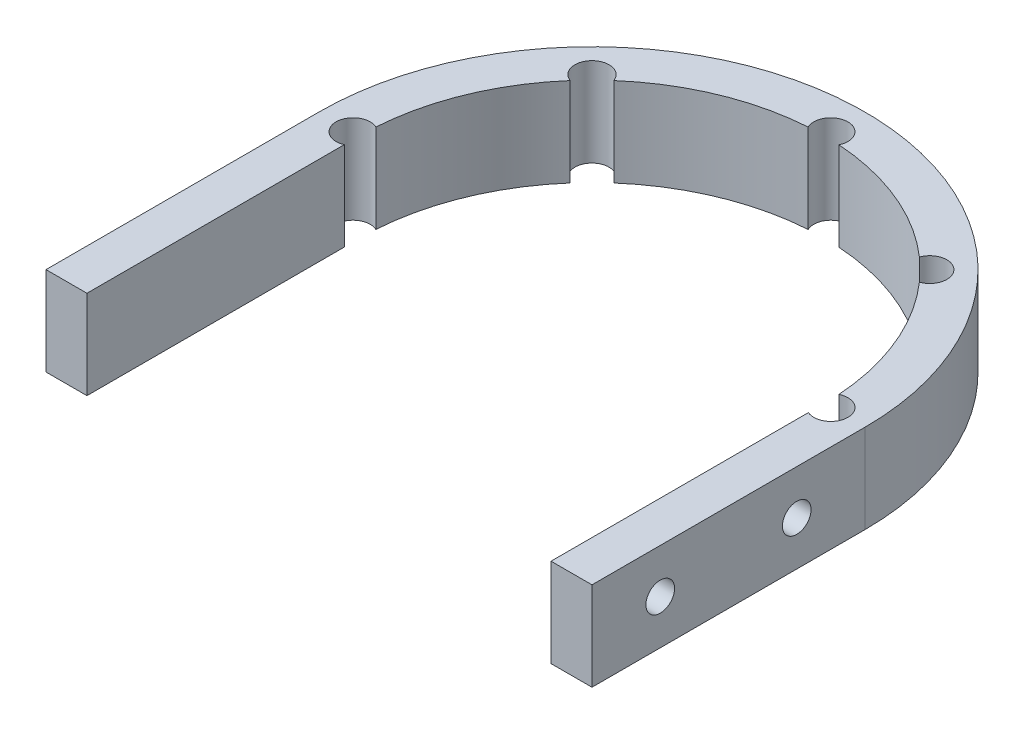
ISO-10303-21;
HEADER;
FILE_DESCRIPTION(('STEP AP214'),'2;1');
FILE_NAME('part.step','',(''),(''),'','','');
FILE_SCHEMA(('AUTOMOTIVE_DESIGN { 1 0 10303 214 1 1 1 1 }'));
ENDSEC;
DATA;
#1=APPLICATION_CONTEXT('core data for automotive mechanical design processes');
#2=APPLICATION_PROTOCOL_DEFINITION('international standard','automotive_design',2000,#1);
#3=PRODUCT_CONTEXT('',#1,'mechanical');
#4=PRODUCT('Part','Part','',(#3));
#5=PRODUCT_RELATED_PRODUCT_CATEGORY('part','',(#4));
#6=PRODUCT_DEFINITION_FORMATION('','',#4);
#7=PRODUCT_DEFINITION_CONTEXT('part definition',#1,'design');
#8=PRODUCT_DEFINITION('design','',#6,#7);
#9=PRODUCT_DEFINITION_SHAPE('','',#8);
#10=(LENGTH_UNIT() NAMED_UNIT(*) SI_UNIT(.MILLI.,.METRE.));
#11=(NAMED_UNIT(*) PLANE_ANGLE_UNIT() SI_UNIT($,.RADIAN.));
#12=(NAMED_UNIT(*) SI_UNIT($,.STERADIAN.) SOLID_ANGLE_UNIT());
#13=UNCERTAINTY_MEASURE_WITH_UNIT(LENGTH_MEASURE(1.E-05),#10,'distance_accuracy_value','');
#14=(GEOMETRIC_REPRESENTATION_CONTEXT(3) GLOBAL_UNCERTAINTY_ASSIGNED_CONTEXT((#13)) GLOBAL_UNIT_ASSIGNED_CONTEXT((#10,
#11,#12)) REPRESENTATION_CONTEXT('',''));
#15=CARTESIAN_POINT('',(0.,0.,0.));
#16=DIRECTION('',(0.,0.,1.));
#17=DIRECTION('',(1.,0.,0.));
#18=AXIS2_PLACEMENT_3D('',#15,#16,#17);
#19=CARTESIAN_POINT('',(-40.,13.,40.));
#20=DIRECTION('',(0.,0.,-1.));
#21=DIRECTION('',(-1.,0.,0.));
#22=AXIS2_PLACEMENT_3D('',#19,#20,#21);
#23=PLANE('',#22);
#24=DIRECTION('',(1.,0.,0.));
#25=VECTOR('',#24,1.);
#26=CARTESIAN_POINT('',(-40.,0.,40.));
#27=LINE('',#26,#25);
#28=CARTESIAN_POINT('',(-40.,0.,40.));
#29=VERTEX_POINT('',#28);
#30=CARTESIAN_POINT('',(-34.,0.,40.));
#31=VERTEX_POINT('',#30);
#32=EDGE_CURVE('E169',#29,#31,#27,.T.);
#33=ORIENTED_EDGE('',*,*,#32,.T.);
#34=DIRECTION('',(0.,1.,0.));
#35=VECTOR('',#34,1.);
#36=CARTESIAN_POINT('',(-34.,0.,40.));
#37=LINE('',#36,#35);
#38=CARTESIAN_POINT('',(-34.,13.,40.));
#39=VERTEX_POINT('',#38);
#40=EDGE_CURVE('E153',#31,#39,#37,.T.);
#41=ORIENTED_EDGE('',*,*,#40,.T.);
#42=DIRECTION('',(1.,0.,0.));
#43=VECTOR('',#42,1.);
#44=CARTESIAN_POINT('',(-40.,13.,40.));
#45=LINE('',#44,#43);
#46=CARTESIAN_POINT('',(-40.,13.,40.));
#47=VERTEX_POINT('',#46);
#48=EDGE_CURVE('E286',#47,#39,#45,.T.);
#49=ORIENTED_EDGE('',*,*,#48,.F.);
#50=DIRECTION('',(0.,-1.,0.));
#51=VECTOR('',#50,1.);
#52=CARTESIAN_POINT('',(-40.,13.,40.));
#53=LINE('',#52,#51);
#54=EDGE_CURVE('E176',#47,#29,#53,.T.);
#55=ORIENTED_EDGE('',*,*,#54,.T.);
#56=EDGE_LOOP('',(#33,#41,#49,#55));
#57=FACE_BOUND('',#56,.T.);
#58=ADVANCED_FACE('F42',(#57),#23,.F.);
#59=CARTESIAN_POINT('',(0.,13.,0.));
#60=DIRECTION('',(0.,-1.,0.));
#61=DIRECTION('',(0.,0.,-1.));
#62=AXIS2_PLACEMENT_3D('',#59,#60,#61);
#63=CYLINDRICAL_SURFACE('',#62,34.);
#64=DIRECTION('',(0.,1.,0.));
#65=VECTOR('',#64,1.);
#66=CARTESIAN_POINT('',(2.25707221860532,6.5,-33.925));
#67=LINE('',#66,#65);
#68=CARTESIAN_POINT('',(2.25707221860533,0.,-33.925));
#69=VERTEX_POINT('',#68);
#70=CARTESIAN_POINT('',(2.25707221860533,13.,-33.925));
#71=VERTEX_POINT('',#70);
#72=EDGE_CURVE('E226',#69,#71,#67,.T.);
#73=ORIENTED_EDGE('',*,*,#72,.F.);
#74=CARTESIAN_POINT('',(0.,0.,0.));
#75=DIRECTION('',(0.,1.,0.));
#76=DIRECTION('',(0.,0.,1.));
#77=AXIS2_PLACEMENT_3D('',#74,#75,#76);
#78=CIRCLE('',#77,34.);
#79=CARTESIAN_POINT('',(22.39260648035,0.,-25.5845886231572));
#80=VERTEX_POINT('',#79);
#81=EDGE_CURVE('E331',#80,#69,#78,.T.);
#82=ORIENTED_EDGE('',*,*,#81,.F.);
#83=DIRECTION('',(0.,1.,0.));
#84=VECTOR('',#83,1.);
#85=CARTESIAN_POINT('',(22.39260648035,6.5,-25.5845886231572));
#86=LINE('',#85,#84);
#87=CARTESIAN_POINT('',(22.39260648035,13.,-25.5845886231572));
#88=VERTEX_POINT('',#87);
#89=EDGE_CURVE('E217',#88,#80,#86,.F.);
#90=ORIENTED_EDGE('',*,*,#89,.F.);
#91=CARTESIAN_POINT('',(0.,13.,0.));
#92=DIRECTION('',(0.,1.,0.));
#93=DIRECTION('',(0.,0.,1.));
#94=AXIS2_PLACEMENT_3D('',#91,#92,#93);
#95=CIRCLE('',#94,34.);
#96=EDGE_CURVE('E298',#88,#71,#95,.T.);
#97=ORIENTED_EDGE('',*,*,#96,.T.);
#98=EDGE_LOOP('',(#73,#82,#90,#97));
#99=FACE_BOUND('',#98,.T.);
#100=ADVANCED_FACE('F399',(#99),#63,.F.);
#101=DIRECTION('',(0.,1.,0.));
#102=VECTOR('',#101,1.);
#103=CARTESIAN_POINT('',(25.5845886231572,6.5,-22.39260648035));
#104=LINE('',#103,#102);
#105=CARTESIAN_POINT('',(25.5845886231572,0.,-22.39260648035));
#106=VERTEX_POINT('',#105);
#107=CARTESIAN_POINT('',(25.5845886231572,13.,-22.39260648035));
#108=VERTEX_POINT('',#107);
#109=EDGE_CURVE('E220',#106,#108,#104,.T.);
#110=ORIENTED_EDGE('',*,*,#109,.F.);
#111=CARTESIAN_POINT('',(33.925,0.,-2.25707221860534));
#112=VERTEX_POINT('',#111);
#113=EDGE_CURVE('E273',#112,#106,#78,.T.);
#114=ORIENTED_EDGE('',*,*,#113,.F.);
#115=DIRECTION('',(0.,1.,0.));
#116=VECTOR('',#115,1.);
#117=CARTESIAN_POINT('',(33.925,6.5,-2.25707221860533));
#118=LINE('',#117,#116);
#119=CARTESIAN_POINT('',(33.925,13.,-2.25707221860534));
#120=VERTEX_POINT('',#119);
#121=EDGE_CURVE('E213',#120,#112,#118,.F.);
#122=ORIENTED_EDGE('',*,*,#121,.F.);
#123=EDGE_CURVE('E243',#120,#108,#95,.T.);
#124=ORIENTED_EDGE('',*,*,#123,.T.);
#125=EDGE_LOOP('',(#110,#114,#122,#124));
#126=FACE_BOUND('',#125,.T.);
#127=ADVANCED_FACE('F337',(#126),#63,.F.);
#128=DIRECTION('',(0.,1.,0.));
#129=VECTOR('',#128,1.);
#130=CARTESIAN_POINT('',(-33.925,6.5,-2.25707221860532));
#131=LINE('',#130,#129);
#132=CARTESIAN_POINT('',(-33.925,0.,-2.25707221860533));
#133=VERTEX_POINT('',#132);
#134=CARTESIAN_POINT('',(-33.925,13.,-2.25707221860533));
#135=VERTEX_POINT('',#134);
#136=EDGE_CURVE('E210',#133,#135,#131,.T.);
#137=ORIENTED_EDGE('',*,*,#136,.F.);
#138=CARTESIAN_POINT('',(-25.5845886231572,0.,-22.39260648035));
#139=VERTEX_POINT('',#138);
#140=EDGE_CURVE('E274',#139,#133,#78,.T.);
#141=ORIENTED_EDGE('',*,*,#140,.F.);
#142=DIRECTION('',(0.,1.,0.));
#143=VECTOR('',#142,1.);
#144=CARTESIAN_POINT('',(-25.5845886231572,6.5,-22.39260648035));
#145=LINE('',#144,#143);
#146=CARTESIAN_POINT('',(-25.5845886231572,13.,-22.39260648035));
#147=VERTEX_POINT('',#146);
#148=EDGE_CURVE('E204',#147,#139,#145,.F.);
#149=ORIENTED_EDGE('',*,*,#148,.F.);
#150=EDGE_CURVE('E268',#147,#135,#95,.T.);
#151=ORIENTED_EDGE('',*,*,#150,.T.);
#152=EDGE_LOOP('',(#137,#141,#149,#151));
#153=FACE_BOUND('',#152,.T.);
#154=ADVANCED_FACE('F327',(#153),#63,.F.);
#155=CARTESIAN_POINT('',(0.,13.,0.));
#156=DIRECTION('',(0.,1.,0.));
#157=DIRECTION('',(0.,0.,1.));
#158=AXIS2_PLACEMENT_3D('',#155,#156,#157);
#159=PLANE('',#158);
#160=DIRECTION('',(0.,0.,1.));
#161=VECTOR('',#160,1.);
#162=CARTESIAN_POINT('',(-34.,13.,40.));
#163=LINE('',#162,#161);
#164=CARTESIAN_POINT('',(-34.,13.,2.29128784747793));
#165=VERTEX_POINT('',#164);
#166=EDGE_CURVE('E156',#165,#39,#163,.T.);
#167=ORIENTED_EDGE('',*,*,#166,.F.);
#168=CARTESIAN_POINT('',(-35.,13.,0.));
#169=DIRECTION('',(0.,1.,0.));
#170=DIRECTION('',(0.,0.,1.));
#171=AXIS2_PLACEMENT_3D('',#168,#169,#170);
#172=CIRCLE('',#171,2.5);
#173=EDGE_CURVE('E252',#135,#165,#172,.T.);
#174=ORIENTED_EDGE('',*,*,#173,.F.);
#175=ORIENTED_EDGE('',*,*,#150,.F.);
#176=CARTESIAN_POINT('',(-24.7487373415292,13.,-24.7487373415292));
#177=DIRECTION('',(0.,1.,0.));
#178=DIRECTION('',(0.,0.,1.));
#179=AXIS2_PLACEMENT_3D('',#176,#177,#178);
#180=CIRCLE('',#179,2.5);
#181=CARTESIAN_POINT('',(-22.39260648035,13.,-25.5845886231572));
#182=VERTEX_POINT('',#181);
#183=EDGE_CURVE('E261',#182,#147,#180,.T.);
#184=ORIENTED_EDGE('',*,*,#183,.F.);
#185=CARTESIAN_POINT('',(-2.25707221860533,13.,-33.925));
#186=VERTEX_POINT('',#185);
#187=EDGE_CURVE('E272',#186,#182,#95,.T.);
#188=ORIENTED_EDGE('',*,*,#187,.F.);
#189=CARTESIAN_POINT('',(0.,13.,-35.));
#190=DIRECTION('',(0.,1.,0.));
#191=DIRECTION('',(0.,0.,1.));
#192=AXIS2_PLACEMENT_3D('',#189,#190,#191);
#193=CIRCLE('',#192,2.5);
#194=EDGE_CURVE('E318',#71,#186,#193,.T.);
#195=ORIENTED_EDGE('',*,*,#194,.F.);
#196=ORIENTED_EDGE('',*,*,#96,.F.);
#197=CARTESIAN_POINT('',(24.7487373415292,13.,-24.7487373415292));
#198=DIRECTION('',(0.,1.,0.));
#199=DIRECTION('',(0.,0.,1.));
#200=AXIS2_PLACEMENT_3D('',#197,#198,#199);
#201=CIRCLE('',#200,2.5);
#202=EDGE_CURVE('E250',#108,#88,#201,.T.);
#203=ORIENTED_EDGE('',*,*,#202,.F.);
#204=ORIENTED_EDGE('',*,*,#123,.F.);
#205=CARTESIAN_POINT('',(35.,13.,0.));
#206=DIRECTION('',(0.,1.,0.));
#207=DIRECTION('',(0.,0.,1.));
#208=AXIS2_PLACEMENT_3D('',#205,#206,#207);
#209=CIRCLE('',#208,2.5);
#210=CARTESIAN_POINT('',(34.,13.,2.29128784747792));
#211=VERTEX_POINT('',#210);
#212=EDGE_CURVE('E233',#211,#120,#209,.T.);
#213=ORIENTED_EDGE('',*,*,#212,.F.);
#214=DIRECTION('',(0.,0.,-1.));
#215=VECTOR('',#214,1.);
#216=CARTESIAN_POINT('',(34.,13.,40.));
#217=LINE('',#216,#215);
#218=CARTESIAN_POINT('',(34.,13.,40.));
#219=VERTEX_POINT('',#218);
#220=EDGE_CURVE('E65',#219,#211,#217,.T.);
#221=ORIENTED_EDGE('',*,*,#220,.F.);
#222=CARTESIAN_POINT('',(40.,13.,40.));
#223=VERTEX_POINT('',#222);
#224=EDGE_CURVE('E285',#219,#223,#45,.T.);
#225=ORIENTED_EDGE('',*,*,#224,.T.);
#226=DIRECTION('',(0.,0.,-1.));
#227=VECTOR('',#226,1.);
#228=CARTESIAN_POINT('',(40.,13.,0.));
#229=LINE('',#228,#227);
#230=CARTESIAN_POINT('',(40.,13.,0.));
#231=VERTEX_POINT('',#230);
#232=EDGE_CURVE('E194',#223,#231,#229,.T.);
#233=ORIENTED_EDGE('',*,*,#232,.T.);
#234=CARTESIAN_POINT('',(0.,13.,0.));
#235=DIRECTION('',(0.,1.,0.));
#236=DIRECTION('',(0.,0.,1.));
#237=AXIS2_PLACEMENT_3D('',#234,#235,#236);
#238=CIRCLE('',#237,40.);
#239=CARTESIAN_POINT('',(-40.,13.,0.));
#240=VERTEX_POINT('',#239);
#241=EDGE_CURVE('E183',#231,#240,#238,.T.);
#242=ORIENTED_EDGE('',*,*,#241,.T.);
#243=DIRECTION('',(0.,0.,1.));
#244=VECTOR('',#243,1.);
#245=CARTESIAN_POINT('',(-40.,13.,0.));
#246=LINE('',#245,#244);
#247=EDGE_CURVE('E282',#240,#47,#246,.T.);
#248=ORIENTED_EDGE('',*,*,#247,.T.);
#249=ORIENTED_EDGE('',*,*,#48,.T.);
#250=EDGE_LOOP('',(#167,#174,#175,#184,#188,#195,#196,#203,#204,#213,#221,#225,#233,#242,#248,#249));
#251=FACE_BOUND('',#250,.T.);
#252=ADVANCED_FACE('F239',(#251),#159,.T.);
#253=CARTESIAN_POINT('',(0.,0.,0.));
#254=DIRECTION('',(0.,1.,0.));
#255=DIRECTION('',(0.,0.,1.));
#256=AXIS2_PLACEMENT_3D('',#253,#254,#255);
#257=PLANE('',#256);
#258=CARTESIAN_POINT('',(-35.,0.,0.));
#259=DIRECTION('',(0.,1.,0.));
#260=DIRECTION('',(0.,0.,1.));
#261=AXIS2_PLACEMENT_3D('',#258,#259,#260);
#262=CIRCLE('',#261,2.5);
#263=CARTESIAN_POINT('',(-34.,0.,2.29128784747793));
#264=VERTEX_POINT('',#263);
#265=EDGE_CURVE('E171',#133,#264,#262,.T.);
#266=ORIENTED_EDGE('',*,*,#265,.T.);
#267=DIRECTION('',(0.,0.,1.));
#268=VECTOR('',#267,1.);
#269=CARTESIAN_POINT('',(-34.,0.,40.));
#270=LINE('',#269,#268);
#271=EDGE_CURVE('E58',#264,#31,#270,.T.);
#272=ORIENTED_EDGE('',*,*,#271,.T.);
#273=ORIENTED_EDGE('',*,*,#32,.F.);
#274=DIRECTION('',(0.,0.,1.));
#275=VECTOR('',#274,1.);
#276=CARTESIAN_POINT('',(-40.,0.,0.));
#277=LINE('',#276,#275);
#278=CARTESIAN_POINT('',(-40.,0.,0.));
#279=VERTEX_POINT('',#278);
#280=EDGE_CURVE('E185',#279,#29,#277,.T.);
#281=ORIENTED_EDGE('',*,*,#280,.F.);
#282=CARTESIAN_POINT('',(0.,0.,0.));
#283=DIRECTION('',(0.,1.,0.));
#284=DIRECTION('',(0.,0.,1.));
#285=AXIS2_PLACEMENT_3D('',#282,#283,#284);
#286=CIRCLE('',#285,40.);
#287=CARTESIAN_POINT('',(40.,0.,0.));
#288=VERTEX_POINT('',#287);
#289=EDGE_CURVE('E290',#288,#279,#286,.T.);
#290=ORIENTED_EDGE('',*,*,#289,.F.);
#291=DIRECTION('',(0.,0.,-1.));
#292=VECTOR('',#291,1.);
#293=CARTESIAN_POINT('',(40.,0.,0.));
#294=LINE('',#293,#292);
#295=CARTESIAN_POINT('',(40.,0.,40.));
#296=VERTEX_POINT('',#295);
#297=EDGE_CURVE('E178',#296,#288,#294,.T.);
#298=ORIENTED_EDGE('',*,*,#297,.F.);
#299=CARTESIAN_POINT('',(34.,0.,40.));
#300=VERTEX_POINT('',#299);
#301=EDGE_CURVE('E179',#300,#296,#27,.T.);
#302=ORIENTED_EDGE('',*,*,#301,.F.);
#303=DIRECTION('',(0.,0.,-1.));
#304=VECTOR('',#303,1.);
#305=CARTESIAN_POINT('',(34.,0.,40.));
#306=LINE('',#305,#304);
#307=CARTESIAN_POINT('',(34.,0.,2.29128784747792));
#308=VERTEX_POINT('',#307);
#309=EDGE_CURVE('E163',#300,#308,#306,.T.);
#310=ORIENTED_EDGE('',*,*,#309,.T.);
#311=CARTESIAN_POINT('',(35.,0.,0.));
#312=DIRECTION('',(0.,1.,0.));
#313=DIRECTION('',(0.,0.,1.));
#314=AXIS2_PLACEMENT_3D('',#311,#312,#313);
#315=CIRCLE('',#314,2.5);
#316=EDGE_CURVE('E235',#308,#112,#315,.T.);
#317=ORIENTED_EDGE('',*,*,#316,.T.);
#318=ORIENTED_EDGE('',*,*,#113,.T.);
#319=CARTESIAN_POINT('',(24.7487373415292,0.,-24.7487373415292));
#320=DIRECTION('',(0.,1.,0.));
#321=DIRECTION('',(0.,0.,1.));
#322=AXIS2_PLACEMENT_3D('',#319,#320,#321);
#323=CIRCLE('',#322,2.5);
#324=EDGE_CURVE('E245',#106,#80,#323,.T.);
#325=ORIENTED_EDGE('',*,*,#324,.T.);
#326=ORIENTED_EDGE('',*,*,#81,.T.);
#327=CARTESIAN_POINT('',(0.,0.,-35.));
#328=DIRECTION('',(0.,1.,0.));
#329=DIRECTION('',(0.,0.,1.));
#330=AXIS2_PLACEMENT_3D('',#327,#328,#329);
#331=CIRCLE('',#330,2.5);
#332=CARTESIAN_POINT('',(-2.25707221860533,0.,-33.925));
#333=VERTEX_POINT('',#332);
#334=EDGE_CURVE('E278',#69,#333,#331,.T.);
#335=ORIENTED_EDGE('',*,*,#334,.T.);
#336=CARTESIAN_POINT('',(-22.39260648035,0.,-25.5845886231572));
#337=VERTEX_POINT('',#336);
#338=EDGE_CURVE('E277',#333,#337,#78,.T.);
#339=ORIENTED_EDGE('',*,*,#338,.T.);
#340=CARTESIAN_POINT('',(-24.7487373415292,0.,-24.7487373415292));
#341=DIRECTION('',(0.,1.,0.));
#342=DIRECTION('',(0.,0.,1.));
#343=AXIS2_PLACEMENT_3D('',#340,#341,#342);
#344=CIRCLE('',#343,2.5);
#345=EDGE_CURVE('E264',#337,#139,#344,.T.);
#346=ORIENTED_EDGE('',*,*,#345,.T.);
#347=ORIENTED_EDGE('',*,*,#140,.T.);
#348=EDGE_LOOP('',(#266,#272,#273,#281,#290,#298,#302,#310,#317,#318,#325,#326,#335,#339,#346,#347));
#349=FACE_BOUND('',#348,.T.);
#350=ADVANCED_FACE('F168',(#349),#257,.F.);
#351=CARTESIAN_POINT('',(0.,13.,0.));
#352=DIRECTION('',(0.,-1.,0.));
#353=DIRECTION('',(0.,0.,-1.));
#354=AXIS2_PLACEMENT_3D('',#351,#352,#353);
#355=CYLINDRICAL_SURFACE('',#354,40.);
#356=ORIENTED_EDGE('',*,*,#289,.T.);
#357=DIRECTION('',(0.,-1.,0.));
#358=VECTOR('',#357,1.);
#359=CARTESIAN_POINT('',(-40.,13.,0.));
#360=LINE('',#359,#358);
#361=EDGE_CURVE('E200',#240,#279,#360,.T.);
#362=ORIENTED_EDGE('',*,*,#361,.F.);
#363=ORIENTED_EDGE('',*,*,#241,.F.);
#364=DIRECTION('',(0.,-1.,0.));
#365=VECTOR('',#364,1.);
#366=CARTESIAN_POINT('',(40.,13.,0.));
#367=LINE('',#366,#365);
#368=EDGE_CURVE('E189',#231,#288,#367,.T.);
#369=ORIENTED_EDGE('',*,*,#368,.T.);
#370=EDGE_LOOP('',(#356,#362,#363,#369));
#371=FACE_BOUND('',#370,.T.);
#372=ADVANCED_FACE('F44',(#371),#355,.T.);
#373=CARTESIAN_POINT('',(-40.,13.,0.));
#374=DIRECTION('',(1.,0.,0.));
#375=DIRECTION('',(0.,0.,-1.));
#376=AXIS2_PLACEMENT_3D('',#373,#374,#375);
#377=PLANE('',#376);
#378=CARTESIAN_POINT('',(-40.,6.5,10.));
#379=DIRECTION('',(-1.,0.,0.));
#380=DIRECTION('',(0.,0.,1.));
#381=AXIS2_PLACEMENT_3D('',#378,#379,#380);
#382=CIRCLE('',#381,2.1);
#383=CARTESIAN_POINT('',(-40.,6.5,12.1));
#384=VERTEX_POINT('',#383);
#385=EDGE_CURVE('E364',#384,#384,#382,.T.);
#386=ORIENTED_EDGE('',*,*,#385,.F.);
#387=EDGE_LOOP('',(#386));
#388=FACE_BOUND('',#387,.T.);
#389=CARTESIAN_POINT('',(-40.,6.5,30.));
#390=DIRECTION('',(-1.,0.,0.));
#391=DIRECTION('',(0.,0.,1.));
#392=AXIS2_PLACEMENT_3D('',#389,#390,#391);
#393=CIRCLE('',#392,2.1);
#394=CARTESIAN_POINT('',(-40.,6.5,32.1));
#395=VERTEX_POINT('',#394);
#396=EDGE_CURVE('E359',#395,#395,#393,.T.);
#397=ORIENTED_EDGE('',*,*,#396,.F.);
#398=EDGE_LOOP('',(#397));
#399=FACE_BOUND('',#398,.T.);
#400=ORIENTED_EDGE('',*,*,#280,.T.);
#401=ORIENTED_EDGE('',*,*,#54,.F.);
#402=ORIENTED_EDGE('',*,*,#247,.F.);
#403=ORIENTED_EDGE('',*,*,#361,.T.);
#404=EDGE_LOOP('',(#400,#401,#402,#403));
#405=FACE_BOUND('',#404,.T.);
#406=ADVANCED_FACE('F409',(#388,#399,#405),#377,.F.);
#407=ORIENTED_EDGE('',*,*,#224,.F.);
#408=DIRECTION('',(0.,1.,0.));
#409=VECTOR('',#408,1.);
#410=CARTESIAN_POINT('',(34.,0.,40.));
#411=LINE('',#410,#409);
#412=EDGE_CURVE('E162',#300,#219,#411,.T.);
#413=ORIENTED_EDGE('',*,*,#412,.F.);
#414=ORIENTED_EDGE('',*,*,#301,.T.);
#415=DIRECTION('',(0.,-1.,0.));
#416=VECTOR('',#415,1.);
#417=CARTESIAN_POINT('',(40.,13.,40.));
#418=LINE('',#417,#416);
#419=EDGE_CURVE('E193',#223,#296,#418,.T.);
#420=ORIENTED_EDGE('',*,*,#419,.F.);
#421=EDGE_LOOP('',(#407,#413,#414,#420));
#422=FACE_BOUND('',#421,.T.);
#423=ADVANCED_FACE('F401',(#422),#23,.F.);
#424=CARTESIAN_POINT('',(40.,13.,0.));
#425=DIRECTION('',(-1.,0.,0.));
#426=DIRECTION('',(0.,0.,1.));
#427=AXIS2_PLACEMENT_3D('',#424,#425,#426);
#428=PLANE('',#427);
#429=CARTESIAN_POINT('',(40.,6.5,10.));
#430=DIRECTION('',(-1.,0.,0.));
#431=DIRECTION('',(0.,0.,1.));
#432=AXIS2_PLACEMENT_3D('',#429,#430,#431);
#433=CIRCLE('',#432,2.1);
#434=CARTESIAN_POINT('',(40.,6.5,12.1));
#435=VERTEX_POINT('',#434);
#436=EDGE_CURVE('E379',#435,#435,#433,.T.);
#437=ORIENTED_EDGE('',*,*,#436,.T.);
#438=EDGE_LOOP('',(#437));
#439=FACE_BOUND('',#438,.T.);
#440=CARTESIAN_POINT('',(40.,6.5,30.));
#441=DIRECTION('',(-1.,0.,0.));
#442=DIRECTION('',(0.,0.,1.));
#443=AXIS2_PLACEMENT_3D('',#440,#441,#442);
#444=CIRCLE('',#443,2.1);
#445=CARTESIAN_POINT('',(40.,6.5,32.1));
#446=VERTEX_POINT('',#445);
#447=EDGE_CURVE('E371',#446,#446,#444,.T.);
#448=ORIENTED_EDGE('',*,*,#447,.T.);
#449=EDGE_LOOP('',(#448));
#450=FACE_BOUND('',#449,.T.);
#451=ORIENTED_EDGE('',*,*,#297,.T.);
#452=ORIENTED_EDGE('',*,*,#368,.F.);
#453=ORIENTED_EDGE('',*,*,#232,.F.);
#454=ORIENTED_EDGE('',*,*,#419,.T.);
#455=EDGE_LOOP('',(#451,#452,#453,#454));
#456=FACE_BOUND('',#455,.T.);
#457=ADVANCED_FACE('F408',(#439,#450,#456),#428,.F.);
#458=DIRECTION('',(0.,1.,0.));
#459=VECTOR('',#458,1.);
#460=CARTESIAN_POINT('',(-2.25707221860532,6.5,-33.925));
#461=LINE('',#460,#459);
#462=EDGE_CURVE('E223',#186,#333,#461,.F.);
#463=ORIENTED_EDGE('',*,*,#462,.F.);
#464=ORIENTED_EDGE('',*,*,#187,.T.);
#465=DIRECTION('',(0.,1.,0.));
#466=VECTOR('',#465,1.);
#467=CARTESIAN_POINT('',(-22.39260648035,6.5,-25.5845886231572));
#468=LINE('',#467,#466);
#469=EDGE_CURVE('E207',#337,#182,#468,.T.);
#470=ORIENTED_EDGE('',*,*,#469,.F.);
#471=ORIENTED_EDGE('',*,*,#338,.F.);
#472=EDGE_LOOP('',(#463,#464,#470,#471));
#473=FACE_BOUND('',#472,.T.);
#474=ADVANCED_FACE('F313',(#473),#63,.F.);
#475=CARTESIAN_POINT('',(-24.7487373415292,0.,-24.7487373415292));
#476=DIRECTION('',(0.,1.,0.));
#477=DIRECTION('',(0.,0.,1.));
#478=AXIS2_PLACEMENT_3D('',#475,#476,#477);
#479=CYLINDRICAL_SURFACE('',#478,2.5);
#480=ORIENTED_EDGE('',*,*,#469,.T.);
#481=ORIENTED_EDGE('',*,*,#183,.T.);
#482=ORIENTED_EDGE('',*,*,#148,.T.);
#483=ORIENTED_EDGE('',*,*,#345,.F.);
#484=EDGE_LOOP('',(#480,#481,#482,#483));
#485=FACE_BOUND('',#484,.T.);
#486=ADVANCED_FACE('F323',(#485),#479,.F.);
#487=CARTESIAN_POINT('',(-35.,0.,0.));
#488=DIRECTION('',(0.,1.,0.));
#489=DIRECTION('',(0.,0.,1.));
#490=AXIS2_PLACEMENT_3D('',#487,#488,#489);
#491=CYLINDRICAL_SURFACE('',#490,2.5);
#492=ORIENTED_EDGE('',*,*,#173,.T.);
#493=DIRECTION('',(0.,1.,0.));
#494=VECTOR('',#493,1.);
#495=CARTESIAN_POINT('',(-34.,0.,2.29128784747792));
#496=LINE('',#495,#494);
#497=EDGE_CURVE('E11',#165,#264,#496,.F.);
#498=ORIENTED_EDGE('',*,*,#497,.T.);
#499=ORIENTED_EDGE('',*,*,#265,.F.);
#500=ORIENTED_EDGE('',*,*,#136,.T.);
#501=EDGE_LOOP('',(#492,#498,#499,#500));
#502=FACE_BOUND('',#501,.T.);
#503=ADVANCED_FACE('F430',(#502),#491,.F.);
#504=CARTESIAN_POINT('',(35.,0.,0.));
#505=DIRECTION('',(0.,1.,0.));
#506=DIRECTION('',(0.,0.,1.));
#507=AXIS2_PLACEMENT_3D('',#504,#505,#506);
#508=CYLINDRICAL_SURFACE('',#507,2.5);
#509=ORIENTED_EDGE('',*,*,#316,.F.);
#510=DIRECTION('',(0.,1.,0.));
#511=VECTOR('',#510,1.);
#512=CARTESIAN_POINT('',(34.,0.,2.29128784747792));
#513=LINE('',#512,#511);
#514=EDGE_CURVE('E51',#308,#211,#513,.T.);
#515=ORIENTED_EDGE('',*,*,#514,.T.);
#516=ORIENTED_EDGE('',*,*,#212,.T.);
#517=ORIENTED_EDGE('',*,*,#121,.T.);
#518=EDGE_LOOP('',(#509,#515,#516,#517));
#519=FACE_BOUND('',#518,.T.);
#520=ADVANCED_FACE('F232',(#519),#508,.F.);
#521=CARTESIAN_POINT('',(24.7487373415292,0.,-24.7487373415292));
#522=DIRECTION('',(0.,1.,0.));
#523=DIRECTION('',(0.,0.,1.));
#524=AXIS2_PLACEMENT_3D('',#521,#522,#523);
#525=CYLINDRICAL_SURFACE('',#524,2.5);
#526=ORIENTED_EDGE('',*,*,#109,.T.);
#527=ORIENTED_EDGE('',*,*,#202,.T.);
#528=ORIENTED_EDGE('',*,*,#89,.T.);
#529=ORIENTED_EDGE('',*,*,#324,.F.);
#530=EDGE_LOOP('',(#526,#527,#528,#529));
#531=FACE_BOUND('',#530,.T.);
#532=ADVANCED_FACE('F339',(#531),#525,.F.);
#533=CARTESIAN_POINT('',(0.,0.,-35.));
#534=DIRECTION('',(0.,1.,0.));
#535=DIRECTION('',(0.,0.,1.));
#536=AXIS2_PLACEMENT_3D('',#533,#534,#535);
#537=CYLINDRICAL_SURFACE('',#536,2.5);
#538=ORIENTED_EDGE('',*,*,#72,.T.);
#539=ORIENTED_EDGE('',*,*,#194,.T.);
#540=ORIENTED_EDGE('',*,*,#462,.T.);
#541=ORIENTED_EDGE('',*,*,#334,.F.);
#542=EDGE_LOOP('',(#538,#539,#540,#541));
#543=FACE_BOUND('',#542,.T.);
#544=ADVANCED_FACE('F564',(#543),#537,.F.);
#545=CARTESIAN_POINT('',(34.,0.,40.));
#546=DIRECTION('',(1.,0.,0.));
#547=DIRECTION('',(0.,0.,-1.));
#548=AXIS2_PLACEMENT_3D('',#545,#546,#547);
#549=PLANE('',#548);
#550=ORIENTED_EDGE('',*,*,#309,.F.);
#551=ORIENTED_EDGE('',*,*,#412,.T.);
#552=ORIENTED_EDGE('',*,*,#220,.T.);
#553=ORIENTED_EDGE('',*,*,#514,.F.);
#554=EDGE_LOOP('',(#550,#551,#552,#553));
#555=FACE_BOUND('',#554,.T.);
#556=ADVANCED_FACE('F556',(#555),#549,.F.);
#557=CARTESIAN_POINT('',(-34.,0.,40.));
#558=DIRECTION('',(-1.,0.,0.));
#559=DIRECTION('',(0.,0.,1.));
#560=AXIS2_PLACEMENT_3D('',#557,#558,#559);
#561=PLANE('',#560);
#562=ORIENTED_EDGE('',*,*,#166,.T.);
#563=ORIENTED_EDGE('',*,*,#40,.F.);
#564=ORIENTED_EDGE('',*,*,#271,.F.);
#565=ORIENTED_EDGE('',*,*,#497,.F.);
#566=EDGE_LOOP('',(#562,#563,#564,#565));
#567=FACE_BOUND('',#566,.T.);
#568=ADVANCED_FACE('F154',(#567),#561,.F.);
#569=CARTESIAN_POINT('',(-36.,6.5,30.));
#570=DIRECTION('',(-1.,0.,0.));
#571=DIRECTION('',(0.,0.,1.));
#572=AXIS2_PLACEMENT_3D('',#569,#570,#571);
#573=CYLINDRICAL_SURFACE('',#572,2.1);
#574=CARTESIAN_POINT('',(-36.,6.5,30.));
#575=DIRECTION('',(-1.,0.,0.));
#576=DIRECTION('',(0.,0.,1.));
#577=AXIS2_PLACEMENT_3D('',#574,#575,#576);
#578=CIRCLE('',#577,2.1);
#579=CARTESIAN_POINT('',(-36.,6.5,32.1));
#580=VERTEX_POINT('',#579);
#581=EDGE_CURVE('E355',#580,#580,#578,.T.);
#582=ORIENTED_EDGE('',*,*,#581,.F.);
#583=EDGE_LOOP('',(#582));
#584=FACE_BOUND('',#583,.T.);
#585=ORIENTED_EDGE('',*,*,#396,.T.);
#586=EDGE_LOOP('',(#585));
#587=FACE_BOUND('',#586,.T.);
#588=ADVANCED_FACE('F466',(#584,#587),#573,.F.);
#589=CARTESIAN_POINT('',(-36.,6.5,30.));
#590=DIRECTION('',(-1.,0.,0.));
#591=DIRECTION('',(0.,0.,1.));
#592=AXIS2_PLACEMENT_3D('',#589,#590,#591);
#593=PLANE('',#592);
#594=ORIENTED_EDGE('',*,*,#581,.T.);
#595=EDGE_LOOP('',(#594));
#596=FACE_BOUND('',#595,.T.);
#597=ADVANCED_FACE('F471',(#596),#593,.T.);
#598=CARTESIAN_POINT('',(-36.,6.5,10.));
#599=DIRECTION('',(-1.,0.,0.));
#600=DIRECTION('',(0.,0.,1.));
#601=AXIS2_PLACEMENT_3D('',#598,#599,#600);
#602=CYLINDRICAL_SURFACE('',#601,2.1);
#603=CARTESIAN_POINT('',(-36.,6.5,10.));
#604=DIRECTION('',(-1.,0.,0.));
#605=DIRECTION('',(0.,0.,1.));
#606=AXIS2_PLACEMENT_3D('',#603,#604,#605);
#607=CIRCLE('',#606,2.1);
#608=CARTESIAN_POINT('',(-36.,6.5,12.1));
#609=VERTEX_POINT('',#608);
#610=EDGE_CURVE('E352',#609,#609,#607,.T.);
#611=ORIENTED_EDGE('',*,*,#610,.F.);
#612=EDGE_LOOP('',(#611));
#613=FACE_BOUND('',#612,.T.);
#614=ORIENTED_EDGE('',*,*,#385,.T.);
#615=EDGE_LOOP('',(#614));
#616=FACE_BOUND('',#615,.T.);
#617=ADVANCED_FACE('F482',(#613,#616),#602,.F.);
#618=CARTESIAN_POINT('',(-36.,6.5,10.));
#619=DIRECTION('',(-1.,0.,0.));
#620=DIRECTION('',(0.,0.,1.));
#621=AXIS2_PLACEMENT_3D('',#618,#619,#620);
#622=PLANE('',#621);
#623=ORIENTED_EDGE('',*,*,#610,.T.);
#624=EDGE_LOOP('',(#623));
#625=FACE_BOUND('',#624,.T.);
#626=ADVANCED_FACE('F493',(#625),#622,.T.);
#627=CARTESIAN_POINT('',(36.,6.5,30.));
#628=DIRECTION('',(1.,0.,0.));
#629=DIRECTION('',(0.,0.,-1.));
#630=AXIS2_PLACEMENT_3D('',#627,#628,#629);
#631=CYLINDRICAL_SURFACE('',#630,2.1);
#632=CARTESIAN_POINT('',(36.,6.5,30.));
#633=DIRECTION('',(-1.,0.,0.));
#634=DIRECTION('',(0.,0.,1.));
#635=AXIS2_PLACEMENT_3D('',#632,#633,#634);
#636=CIRCLE('',#635,2.1);
#637=CARTESIAN_POINT('',(36.,6.5,32.1));
#638=VERTEX_POINT('',#637);
#639=EDGE_CURVE('E375',#638,#638,#636,.T.);
#640=ORIENTED_EDGE('',*,*,#639,.T.);
#641=EDGE_LOOP('',(#640));
#642=FACE_BOUND('',#641,.T.);
#643=ORIENTED_EDGE('',*,*,#447,.F.);
#644=EDGE_LOOP('',(#643));
#645=FACE_BOUND('',#644,.T.);
#646=ADVANCED_FACE('F503',(#642,#645),#631,.F.);
#647=CARTESIAN_POINT('',(36.,6.5,30.));
#648=DIRECTION('',(1.,0.,0.));
#649=DIRECTION('',(0.,0.,1.));
#650=AXIS2_PLACEMENT_3D('',#647,#648,#649);
#651=PLANE('',#650);
#652=ORIENTED_EDGE('',*,*,#639,.F.);
#653=EDGE_LOOP('',(#652));
#654=FACE_BOUND('',#653,.T.);
#655=ADVANCED_FACE('F396',(#654),#651,.T.);
#656=CARTESIAN_POINT('',(36.,6.5,10.));
#657=DIRECTION('',(1.,0.,0.));
#658=DIRECTION('',(0.,0.,-1.));
#659=AXIS2_PLACEMENT_3D('',#656,#657,#658);
#660=CYLINDRICAL_SURFACE('',#659,2.1);
#661=CARTESIAN_POINT('',(36.,6.5,10.));
#662=DIRECTION('',(-1.,0.,0.));
#663=DIRECTION('',(0.,0.,1.));
#664=AXIS2_PLACEMENT_3D('',#661,#662,#663);
#665=CIRCLE('',#664,2.1);
#666=CARTESIAN_POINT('',(36.,6.5,12.1));
#667=VERTEX_POINT('',#666);
#668=EDGE_CURVE('E360',#667,#667,#665,.T.);
#669=ORIENTED_EDGE('',*,*,#668,.T.);
#670=EDGE_LOOP('',(#669));
#671=FACE_BOUND('',#670,.T.);
#672=ORIENTED_EDGE('',*,*,#436,.F.);
#673=EDGE_LOOP('',(#672));
#674=FACE_BOUND('',#673,.T.);
#675=ADVANCED_FACE('F387',(#671,#674),#660,.F.);
#676=CARTESIAN_POINT('',(36.,6.5,10.));
#677=DIRECTION('',(1.,0.,0.));
#678=DIRECTION('',(0.,0.,1.));
#679=AXIS2_PLACEMENT_3D('',#676,#677,#678);
#680=PLANE('',#679);
#681=ORIENTED_EDGE('',*,*,#668,.F.);
#682=EDGE_LOOP('',(#681));
#683=FACE_BOUND('',#682,.T.);
#684=ADVANCED_FACE('F390',(#683),#680,.T.);
#685=CLOSED_SHELL('',(#58,#100,#127,#154,#252,#350,#372,#406,#423,#457,#474,#486,#503,#520,#532,
#544,#556,#568,#588,#597,#617,#626,#646,#655,#675,#684));
#686=MANIFOLD_SOLID_BREP('B2',#685);
#687=ADVANCED_BREP_SHAPE_REPRESENTATION('',(#18,#686),#14);
#688=SHAPE_DEFINITION_REPRESENTATION(#9,#687);
ENDSEC;
END-ISO-10303-21;
